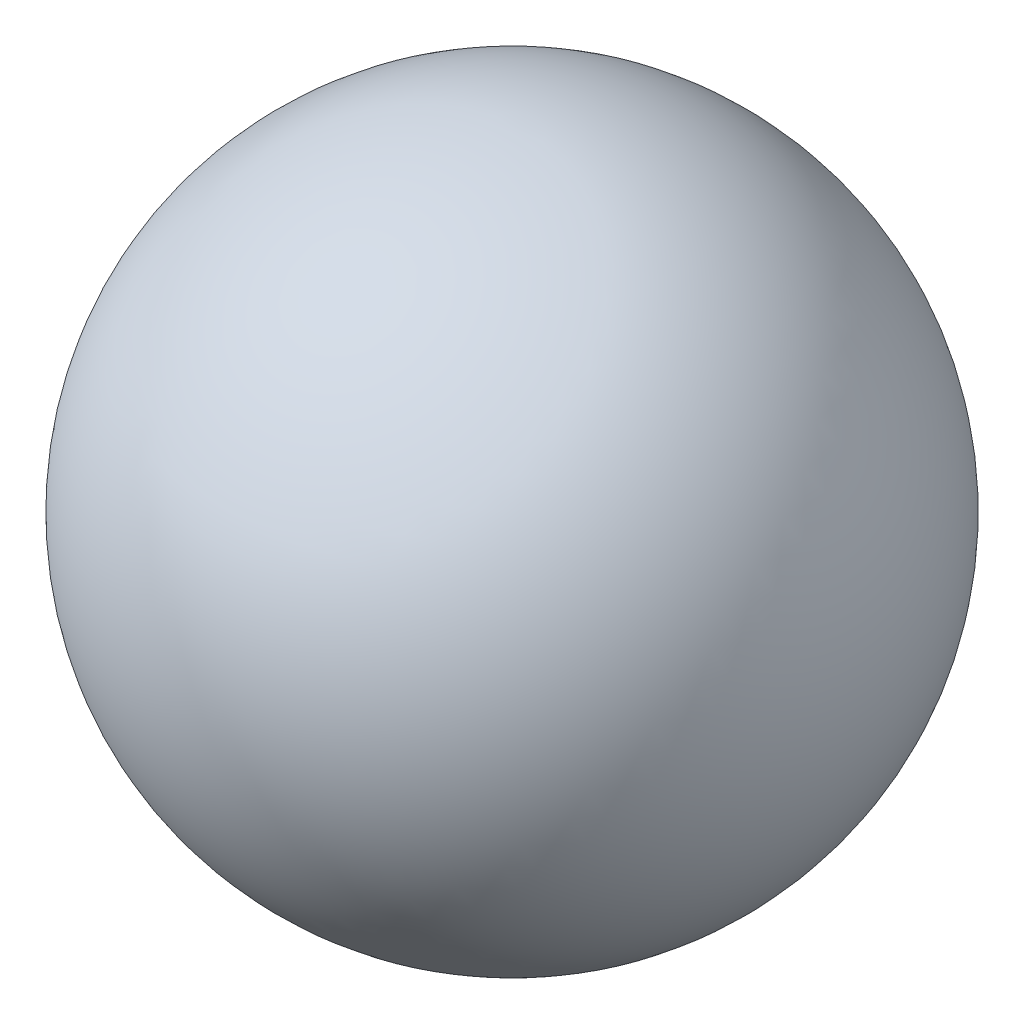
ISO-10303-21;
HEADER;
FILE_DESCRIPTION(('STEP AP214'),'2;1');
FILE_NAME('part.step','',(''),(''),'','','');
FILE_SCHEMA(('AUTOMOTIVE_DESIGN { 1 0 10303 214 1 1 1 1 }'));
ENDSEC;
DATA;
#1=APPLICATION_CONTEXT('core data for automotive mechanical design processes');
#2=APPLICATION_PROTOCOL_DEFINITION('international standard','automotive_design',2000,#1);
#3=PRODUCT_CONTEXT('',#1,'mechanical');
#4=PRODUCT('Part','Part','',(#3));
#5=PRODUCT_RELATED_PRODUCT_CATEGORY('part','',(#4));
#6=PRODUCT_DEFINITION_FORMATION('','',#4);
#7=PRODUCT_DEFINITION_CONTEXT('part definition',#1,'design');
#8=PRODUCT_DEFINITION('design','',#6,#7);
#9=PRODUCT_DEFINITION_SHAPE('','',#8);
#10=(LENGTH_UNIT() NAMED_UNIT(*) SI_UNIT(.MILLI.,.METRE.));
#11=(NAMED_UNIT(*) PLANE_ANGLE_UNIT() SI_UNIT($,.RADIAN.));
#12=(NAMED_UNIT(*) SI_UNIT($,.STERADIAN.) SOLID_ANGLE_UNIT());
#13=UNCERTAINTY_MEASURE_WITH_UNIT(LENGTH_MEASURE(1.E-05),#10,'distance_accuracy_value','');
#14=(GEOMETRIC_REPRESENTATION_CONTEXT(3) GLOBAL_UNCERTAINTY_ASSIGNED_CONTEXT((#13)) GLOBAL_UNIT_ASSIGNED_CONTEXT((#10,
#11,#12)) REPRESENTATION_CONTEXT('',''));
#15=CARTESIAN_POINT('',(0.,0.,0.));
#16=DIRECTION('',(0.,0.,1.));
#17=DIRECTION('',(1.,0.,0.));
#18=AXIS2_PLACEMENT_3D('',#15,#16,#17);
#19=CARTESIAN_POINT('',(0.,0.,0.));
#20=DIRECTION('',(0.,1.,0.));
#21=DIRECTION('',(1.,0.,0.));
#22=AXIS2_PLACEMENT_3D('',#19,#20,#21);
#23=SPHERICAL_SURFACE('',#22,31.25);
#24=CARTESIAN_POINT('',(0.,31.25,0.));
#25=VERTEX_POINT('',#24);
#26=VERTEX_LOOP('',#25);
#27=FACE_BOUND('',#26,.T.);
#28=ADVANCED_FACE('F31',(#27),#23,.T.);
#29=CLOSED_SHELL('',(#28));
#30=MANIFOLD_SOLID_BREP('B2',#29);
#31=ADVANCED_BREP_SHAPE_REPRESENTATION('',(#18,#30),#14);
#32=SHAPE_DEFINITION_REPRESENTATION(#9,#31);
ENDSEC;
END-ISO-10303-21;
